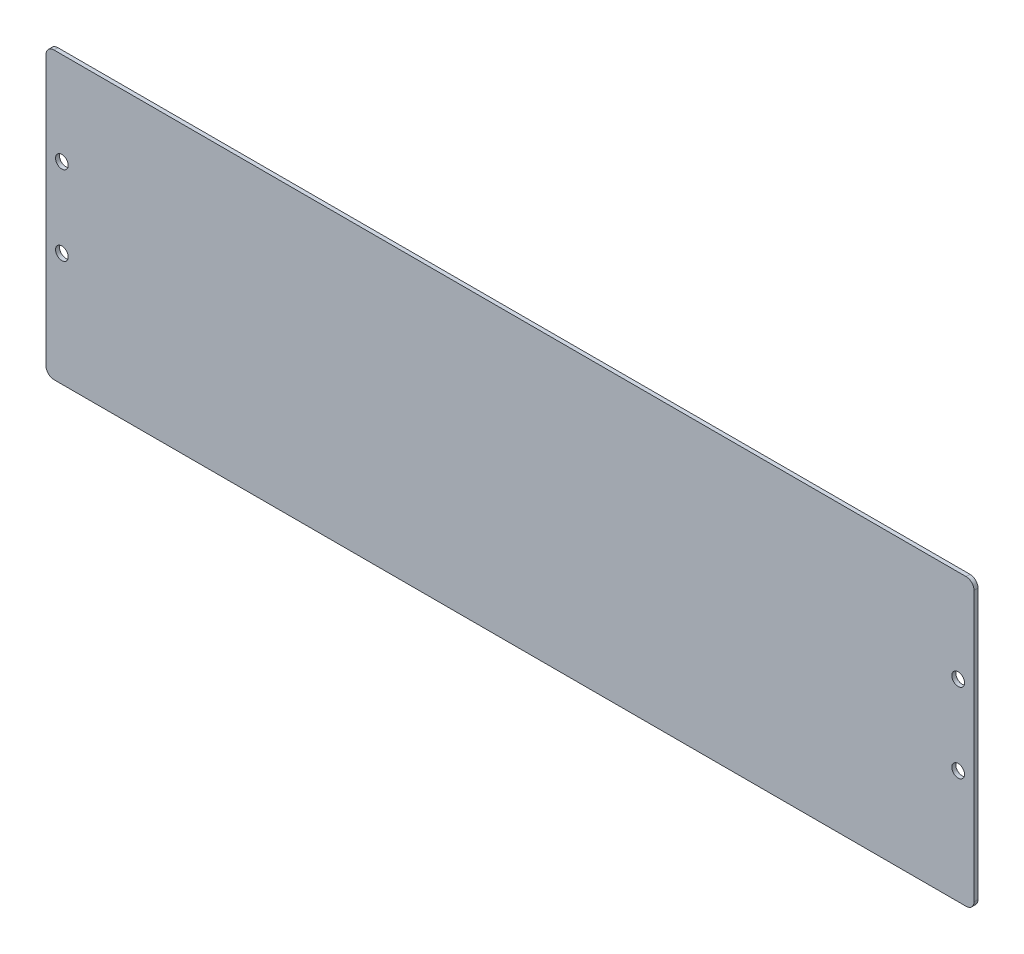
ISO-10303-21;
HEADER;
FILE_DESCRIPTION(('STEP AP214'),'2;1');
FILE_NAME('part.step','',(''),(''),'','','');
FILE_SCHEMA(('AUTOMOTIVE_DESIGN { 1 0 10303 214 1 1 1 1 }'));
ENDSEC;
DATA;
#1=APPLICATION_CONTEXT('core data for automotive mechanical design processes');
#2=APPLICATION_PROTOCOL_DEFINITION('international standard','automotive_design',2000,#1);
#3=PRODUCT_CONTEXT('',#1,'mechanical');
#4=PRODUCT('Part','Part','',(#3));
#5=PRODUCT_RELATED_PRODUCT_CATEGORY('part','',(#4));
#6=PRODUCT_DEFINITION_FORMATION('','',#4);
#7=PRODUCT_DEFINITION_CONTEXT('part definition',#1,'design');
#8=PRODUCT_DEFINITION('design','',#6,#7);
#9=PRODUCT_DEFINITION_SHAPE('','',#8);
#10=(LENGTH_UNIT() NAMED_UNIT(*) SI_UNIT(.MILLI.,.METRE.));
#11=(NAMED_UNIT(*) PLANE_ANGLE_UNIT() SI_UNIT($,.RADIAN.));
#12=(NAMED_UNIT(*) SI_UNIT($,.STERADIAN.) SOLID_ANGLE_UNIT());
#13=UNCERTAINTY_MEASURE_WITH_UNIT(LENGTH_MEASURE(1.E-05),#10,'distance_accuracy_value','');
#14=(GEOMETRIC_REPRESENTATION_CONTEXT(3) GLOBAL_UNCERTAINTY_ASSIGNED_CONTEXT((#13)) GLOBAL_UNIT_ASSIGNED_CONTEXT((#10,
#11,#12)) REPRESENTATION_CONTEXT('',''));
#15=CARTESIAN_POINT('',(0.,0.,0.));
#16=DIRECTION('',(0.,0.,1.));
#17=DIRECTION('',(1.,0.,0.));
#18=AXIS2_PLACEMENT_3D('',#15,#16,#17);
#19=CARTESIAN_POINT('',(0.,0.,1.));
#20=DIRECTION('',(0.,0.,-1.));
#21=DIRECTION('',(-1.,0.,0.));
#22=AXIS2_PLACEMENT_3D('',#19,#20,#21);
#23=PLANE('',#22);
#24=DIRECTION('',(1.,0.,0.));
#25=VECTOR('',#24,1.);
#26=CARTESIAN_POINT('',(-117.,-36.,1.));
#27=LINE('',#26,#25);
#28=CARTESIAN_POINT('',(-115.,-36.,1.));
#29=VERTEX_POINT('',#28);
#30=CARTESIAN_POINT('',(115.,-36.,1.));
#31=VERTEX_POINT('',#30);
#32=EDGE_CURVE('E140',#29,#31,#27,.T.);
#33=ORIENTED_EDGE('',*,*,#32,.T.);
#34=CARTESIAN_POINT('',(115.,-34.,1.));
#35=DIRECTION('',(0.,0.,-1.));
#36=DIRECTION('',(-1.,0.,0.));
#37=AXIS2_PLACEMENT_3D('',#34,#35,#36);
#38=CIRCLE('',#37,2.);
#39=CARTESIAN_POINT('',(117.,-34.,1.));
#40=VERTEX_POINT('',#39);
#41=EDGE_CURVE('E158',#31,#40,#38,.F.);
#42=ORIENTED_EDGE('',*,*,#41,.T.);
#43=DIRECTION('',(0.,1.,0.));
#44=VECTOR('',#43,1.);
#45=CARTESIAN_POINT('',(117.,-36.,1.));
#46=LINE('',#45,#44);
#47=CARTESIAN_POINT('',(117.,34.,1.));
#48=VERTEX_POINT('',#47);
#49=EDGE_CURVE('E122',#40,#48,#46,.T.);
#50=ORIENTED_EDGE('',*,*,#49,.T.);
#51=CARTESIAN_POINT('',(115.,34.,1.));
#52=DIRECTION('',(0.,0.,-1.));
#53=DIRECTION('',(-1.,0.,0.));
#54=AXIS2_PLACEMENT_3D('',#51,#52,#53);
#55=CIRCLE('',#54,2.);
#56=CARTESIAN_POINT('',(115.,36.,1.));
#57=VERTEX_POINT('',#56);
#58=EDGE_CURVE('E154',#48,#57,#55,.F.);
#59=ORIENTED_EDGE('',*,*,#58,.T.);
#60=DIRECTION('',(-1.,0.,0.));
#61=VECTOR('',#60,1.);
#62=CARTESIAN_POINT('',(-117.,36.,1.));
#63=LINE('',#62,#61);
#64=CARTESIAN_POINT('',(-115.,36.,1.));
#65=VERTEX_POINT('',#64);
#66=EDGE_CURVE('E167',#57,#65,#63,.T.);
#67=ORIENTED_EDGE('',*,*,#66,.T.);
#68=CARTESIAN_POINT('',(-115.,34.,1.));
#69=DIRECTION('',(0.,0.,-1.));
#70=DIRECTION('',(-1.,0.,0.));
#71=AXIS2_PLACEMENT_3D('',#68,#69,#70);
#72=CIRCLE('',#71,2.);
#73=CARTESIAN_POINT('',(-117.,34.,1.));
#74=VERTEX_POINT('',#73);
#75=EDGE_CURVE('E57',#65,#74,#72,.F.);
#76=ORIENTED_EDGE('',*,*,#75,.T.);
#77=DIRECTION('',(0.,-1.,0.));
#78=VECTOR('',#77,1.);
#79=CARTESIAN_POINT('',(-117.,-36.,1.));
#80=LINE('',#79,#78);
#81=CARTESIAN_POINT('',(-117.,-34.,1.));
#82=VERTEX_POINT('',#81);
#83=EDGE_CURVE('E173',#74,#82,#80,.T.);
#84=ORIENTED_EDGE('',*,*,#83,.T.);
#85=CARTESIAN_POINT('',(-115.,-34.,1.));
#86=DIRECTION('',(0.,0.,-1.));
#87=DIRECTION('',(-1.,0.,0.));
#88=AXIS2_PLACEMENT_3D('',#85,#86,#87);
#89=CIRCLE('',#88,2.);
#90=EDGE_CURVE('E156',#82,#29,#89,.F.);
#91=ORIENTED_EDGE('',*,*,#90,.T.);
#92=EDGE_LOOP('',(#33,#42,#50,#59,#67,#76,#84,#91));
#93=FACE_BOUND('',#92,.T.);
#94=CARTESIAN_POINT('',(-113.,12.6,1.));
#95=DIRECTION('',(0.,0.,1.));
#96=DIRECTION('',(1.,0.,0.));
#97=AXIS2_PLACEMENT_3D('',#94,#95,#96);
#98=CIRCLE('',#97,1.6);
#99=CARTESIAN_POINT('',(-111.4,12.6,1.));
#100=VERTEX_POINT('',#99);
#101=EDGE_CURVE('E131',#100,#100,#98,.T.);
#102=ORIENTED_EDGE('',*,*,#101,.F.);
#103=EDGE_LOOP('',(#102));
#104=FACE_BOUND('',#103,.T.);
#105=CARTESIAN_POINT('',(-113.,-7.4,1.));
#106=DIRECTION('',(0.,0.,1.));
#107=DIRECTION('',(1.,0.,0.));
#108=AXIS2_PLACEMENT_3D('',#105,#106,#107);
#109=CIRCLE('',#108,1.60000000000001);
#110=CARTESIAN_POINT('',(-111.4,-7.4,1.));
#111=VERTEX_POINT('',#110);
#112=EDGE_CURVE('E188',#111,#111,#109,.T.);
#113=ORIENTED_EDGE('',*,*,#112,.F.);
#114=EDGE_LOOP('',(#113));
#115=FACE_BOUND('',#114,.T.);
#116=CARTESIAN_POINT('',(113.,-7.39999999999998,1.));
#117=DIRECTION('',(0.,0.,1.));
#118=DIRECTION('',(-1.,0.,0.));
#119=AXIS2_PLACEMENT_3D('',#116,#117,#118);
#120=CIRCLE('',#119,1.60000000000001);
#121=CARTESIAN_POINT('',(111.4,-7.39999999999998,1.));
#122=VERTEX_POINT('',#121);
#123=EDGE_CURVE('E193',#122,#122,#120,.T.);
#124=ORIENTED_EDGE('',*,*,#123,.F.);
#125=EDGE_LOOP('',(#124));
#126=FACE_BOUND('',#125,.T.);
#127=CARTESIAN_POINT('',(113.,12.6,1.));
#128=DIRECTION('',(0.,0.,1.));
#129=DIRECTION('',(-1.,0.,0.));
#130=AXIS2_PLACEMENT_3D('',#127,#128,#129);
#131=CIRCLE('',#130,1.6);
#132=CARTESIAN_POINT('',(111.4,12.6,1.));
#133=VERTEX_POINT('',#132);
#134=EDGE_CURVE('E199',#133,#133,#131,.T.);
#135=ORIENTED_EDGE('',*,*,#134,.F.);
#136=EDGE_LOOP('',(#135));
#137=FACE_BOUND('',#136,.T.);
#138=ADVANCED_FACE('F35',(#93,#104,#115,#126,#137),#23,.F.);
#139=CARTESIAN_POINT('',(0.,0.,0.));
#140=DIRECTION('',(0.,0.,-1.));
#141=DIRECTION('',(-1.,0.,0.));
#142=AXIS2_PLACEMENT_3D('',#139,#140,#141);
#143=PLANE('',#142);
#144=CARTESIAN_POINT('',(113.,-7.39999999999998,0.));
#145=DIRECTION('',(0.,0.,1.));
#146=DIRECTION('',(-1.,0.,0.));
#147=AXIS2_PLACEMENT_3D('',#144,#145,#146);
#148=CIRCLE('',#147,1.60000000000001);
#149=CARTESIAN_POINT('',(111.4,-7.39999999999998,0.));
#150=VERTEX_POINT('',#149);
#151=EDGE_CURVE('E196',#150,#150,#148,.T.);
#152=ORIENTED_EDGE('',*,*,#151,.T.);
#153=EDGE_LOOP('',(#152));
#154=FACE_BOUND('',#153,.T.);
#155=CARTESIAN_POINT('',(-113.,12.6,0.));
#156=DIRECTION('',(0.,0.,1.));
#157=DIRECTION('',(1.,0.,0.));
#158=AXIS2_PLACEMENT_3D('',#155,#156,#157);
#159=CIRCLE('',#158,1.6);
#160=CARTESIAN_POINT('',(-111.4,12.6,0.));
#161=VERTEX_POINT('',#160);
#162=EDGE_CURVE('E137',#161,#161,#159,.T.);
#163=ORIENTED_EDGE('',*,*,#162,.T.);
#164=EDGE_LOOP('',(#163));
#165=FACE_BOUND('',#164,.T.);
#166=DIRECTION('',(0.,1.,0.));
#167=VECTOR('',#166,1.);
#168=CARTESIAN_POINT('',(117.,-36.,0.));
#169=LINE('',#168,#167);
#170=CARTESIAN_POINT('',(117.,-34.,0.));
#171=VERTEX_POINT('',#170);
#172=CARTESIAN_POINT('',(117.,34.,0.));
#173=VERTEX_POINT('',#172);
#174=EDGE_CURVE('E119',#171,#173,#169,.T.);
#175=ORIENTED_EDGE('',*,*,#174,.F.);
#176=CARTESIAN_POINT('',(115.,-34.,0.));
#177=DIRECTION('',(0.,0.,-1.));
#178=DIRECTION('',(-1.,0.,0.));
#179=AXIS2_PLACEMENT_3D('',#176,#177,#178);
#180=CIRCLE('',#179,2.);
#181=CARTESIAN_POINT('',(115.,-36.,0.));
#182=VERTEX_POINT('',#181);
#183=EDGE_CURVE('E102',#171,#182,#180,.T.);
#184=ORIENTED_EDGE('',*,*,#183,.T.);
#185=DIRECTION('',(1.,0.,0.));
#186=VECTOR('',#185,1.);
#187=CARTESIAN_POINT('',(-117.,-36.,0.));
#188=LINE('',#187,#186);
#189=CARTESIAN_POINT('',(-115.,-36.,0.));
#190=VERTEX_POINT('',#189);
#191=EDGE_CURVE('E144',#190,#182,#188,.T.);
#192=ORIENTED_EDGE('',*,*,#191,.F.);
#193=CARTESIAN_POINT('',(-115.,-34.,0.));
#194=DIRECTION('',(0.,0.,-1.));
#195=DIRECTION('',(-1.,0.,0.));
#196=AXIS2_PLACEMENT_3D('',#193,#194,#195);
#197=CIRCLE('',#196,2.);
#198=CARTESIAN_POINT('',(-117.,-34.,0.));
#199=VERTEX_POINT('',#198);
#200=EDGE_CURVE('E113',#190,#199,#197,.T.);
#201=ORIENTED_EDGE('',*,*,#200,.T.);
#202=DIRECTION('',(0.,-1.,0.));
#203=VECTOR('',#202,1.);
#204=CARTESIAN_POINT('',(-117.,-36.,0.));
#205=LINE('',#204,#203);
#206=CARTESIAN_POINT('',(-117.,34.,0.));
#207=VERTEX_POINT('',#206);
#208=EDGE_CURVE('E134',#207,#199,#205,.T.);
#209=ORIENTED_EDGE('',*,*,#208,.F.);
#210=CARTESIAN_POINT('',(-115.,34.,0.));
#211=DIRECTION('',(0.,0.,-1.));
#212=DIRECTION('',(-1.,0.,0.));
#213=AXIS2_PLACEMENT_3D('',#210,#211,#212);
#214=CIRCLE('',#213,2.);
#215=CARTESIAN_POINT('',(-115.,36.,0.));
#216=VERTEX_POINT('',#215);
#217=EDGE_CURVE('E123',#207,#216,#214,.T.);
#218=ORIENTED_EDGE('',*,*,#217,.T.);
#219=DIRECTION('',(-1.,0.,0.));
#220=VECTOR('',#219,1.);
#221=CARTESIAN_POINT('',(-117.,36.,0.));
#222=LINE('',#221,#220);
#223=CARTESIAN_POINT('',(115.,36.,0.));
#224=VERTEX_POINT('',#223);
#225=EDGE_CURVE('E130',#224,#216,#222,.T.);
#226=ORIENTED_EDGE('',*,*,#225,.F.);
#227=CARTESIAN_POINT('',(115.,34.,0.));
#228=DIRECTION('',(0.,0.,-1.));
#229=DIRECTION('',(-1.,0.,0.));
#230=AXIS2_PLACEMENT_3D('',#227,#228,#229);
#231=CIRCLE('',#230,2.);
#232=EDGE_CURVE('E129',#224,#173,#231,.T.);
#233=ORIENTED_EDGE('',*,*,#232,.T.);
#234=EDGE_LOOP('',(#175,#184,#192,#201,#209,#218,#226,#233));
#235=FACE_BOUND('',#234,.T.);
#236=CARTESIAN_POINT('',(-113.,-7.4,0.));
#237=DIRECTION('',(0.,0.,1.));
#238=DIRECTION('',(1.,0.,0.));
#239=AXIS2_PLACEMENT_3D('',#236,#237,#238);
#240=CIRCLE('',#239,1.60000000000001);
#241=CARTESIAN_POINT('',(-111.4,-7.4,0.));
#242=VERTEX_POINT('',#241);
#243=EDGE_CURVE('E190',#242,#242,#240,.T.);
#244=ORIENTED_EDGE('',*,*,#243,.T.);
#245=EDGE_LOOP('',(#244));
#246=FACE_BOUND('',#245,.T.);
#247=CARTESIAN_POINT('',(113.,12.6,0.));
#248=DIRECTION('',(0.,0.,1.));
#249=DIRECTION('',(-1.,0.,0.));
#250=AXIS2_PLACEMENT_3D('',#247,#248,#249);
#251=CIRCLE('',#250,1.6);
#252=CARTESIAN_POINT('',(111.4,12.6,0.));
#253=VERTEX_POINT('',#252);
#254=EDGE_CURVE('E202',#253,#253,#251,.T.);
#255=ORIENTED_EDGE('',*,*,#254,.T.);
#256=EDGE_LOOP('',(#255));
#257=FACE_BOUND('',#256,.T.);
#258=ADVANCED_FACE('F126',(#154,#165,#235,#246,#257),#143,.T.);
#259=CARTESIAN_POINT('',(117.,-36.,1.));
#260=DIRECTION('',(-1.,0.,0.));
#261=DIRECTION('',(0.,0.,1.));
#262=AXIS2_PLACEMENT_3D('',#259,#260,#261);
#263=PLANE('',#262);
#264=ORIENTED_EDGE('',*,*,#49,.F.);
#265=DIRECTION('',(0.,0.,-1.));
#266=VECTOR('',#265,1.);
#267=CARTESIAN_POINT('',(117.,-34.,1.));
#268=LINE('',#267,#266);
#269=EDGE_CURVE('E106',#40,#171,#268,.T.);
#270=ORIENTED_EDGE('',*,*,#269,.T.);
#271=ORIENTED_EDGE('',*,*,#174,.T.);
#272=DIRECTION('',(0.,0.,-1.));
#273=VECTOR('',#272,1.);
#274=CARTESIAN_POINT('',(117.,34.,1.));
#275=LINE('',#274,#273);
#276=EDGE_CURVE('E124',#173,#48,#275,.F.);
#277=ORIENTED_EDGE('',*,*,#276,.T.);
#278=EDGE_LOOP('',(#264,#270,#271,#277));
#279=FACE_BOUND('',#278,.T.);
#280=ADVANCED_FACE('F118',(#279),#263,.F.);
#281=CARTESIAN_POINT('',(-117.,36.,1.));
#282=DIRECTION('',(0.,-1.,0.));
#283=DIRECTION('',(0.,0.,-1.));
#284=AXIS2_PLACEMENT_3D('',#281,#282,#283);
#285=PLANE('',#284);
#286=ORIENTED_EDGE('',*,*,#66,.F.);
#287=DIRECTION('',(0.,0.,-1.));
#288=VECTOR('',#287,1.);
#289=CARTESIAN_POINT('',(115.,36.,1.));
#290=LINE('',#289,#288);
#291=EDGE_CURVE('E11',#57,#224,#290,.T.);
#292=ORIENTED_EDGE('',*,*,#291,.T.);
#293=ORIENTED_EDGE('',*,*,#225,.T.);
#294=DIRECTION('',(0.,0.,-1.));
#295=VECTOR('',#294,1.);
#296=CARTESIAN_POINT('',(-115.,36.,1.));
#297=LINE('',#296,#295);
#298=EDGE_CURVE('E43',#216,#65,#297,.F.);
#299=ORIENTED_EDGE('',*,*,#298,.T.);
#300=EDGE_LOOP('',(#286,#292,#293,#299));
#301=FACE_BOUND('',#300,.T.);
#302=ADVANCED_FACE('F166',(#301),#285,.F.);
#303=CARTESIAN_POINT('',(-117.,-36.,1.));
#304=DIRECTION('',(1.,0.,0.));
#305=DIRECTION('',(0.,0.,-1.));
#306=AXIS2_PLACEMENT_3D('',#303,#304,#305);
#307=PLANE('',#306);
#308=ORIENTED_EDGE('',*,*,#208,.T.);
#309=DIRECTION('',(0.,0.,-1.));
#310=VECTOR('',#309,1.);
#311=CARTESIAN_POINT('',(-117.,-34.,1.));
#312=LINE('',#311,#310);
#313=EDGE_CURVE('E50',#199,#82,#312,.F.);
#314=ORIENTED_EDGE('',*,*,#313,.T.);
#315=ORIENTED_EDGE('',*,*,#83,.F.);
#316=DIRECTION('',(0.,0.,-1.));
#317=VECTOR('',#316,1.);
#318=CARTESIAN_POINT('',(-117.,34.,1.));
#319=LINE('',#318,#317);
#320=EDGE_CURVE('E160',#74,#207,#319,.T.);
#321=ORIENTED_EDGE('',*,*,#320,.T.);
#322=EDGE_LOOP('',(#308,#314,#315,#321));
#323=FACE_BOUND('',#322,.T.);
#324=ADVANCED_FACE('F177',(#323),#307,.F.);
#325=CARTESIAN_POINT('',(-117.,-36.,1.));
#326=DIRECTION('',(0.,1.,0.));
#327=DIRECTION('',(0.,0.,1.));
#328=AXIS2_PLACEMENT_3D('',#325,#326,#327);
#329=PLANE('',#328);
#330=ORIENTED_EDGE('',*,*,#191,.T.);
#331=DIRECTION('',(0.,0.,-1.));
#332=VECTOR('',#331,1.);
#333=CARTESIAN_POINT('',(115.,-36.,1.));
#334=LINE('',#333,#332);
#335=EDGE_CURVE('E107',#182,#31,#334,.F.);
#336=ORIENTED_EDGE('',*,*,#335,.T.);
#337=ORIENTED_EDGE('',*,*,#32,.F.);
#338=DIRECTION('',(0.,0.,-1.));
#339=VECTOR('',#338,1.);
#340=CARTESIAN_POINT('',(-115.,-36.,1.));
#341=LINE('',#340,#339);
#342=EDGE_CURVE('E112',#29,#190,#341,.T.);
#343=ORIENTED_EDGE('',*,*,#342,.T.);
#344=EDGE_LOOP('',(#330,#336,#337,#343));
#345=FACE_BOUND('',#344,.T.);
#346=ADVANCED_FACE('F184',(#345),#329,.F.);
#347=CARTESIAN_POINT('',(-113.,12.6,1.));
#348=DIRECTION('',(0.,0.,-1.));
#349=DIRECTION('',(-1.,0.,0.));
#350=AXIS2_PLACEMENT_3D('',#347,#348,#349);
#351=CYLINDRICAL_SURFACE('',#350,1.6);
#352=ORIENTED_EDGE('',*,*,#101,.T.);
#353=EDGE_LOOP('',(#352));
#354=FACE_BOUND('',#353,.T.);
#355=ORIENTED_EDGE('',*,*,#162,.F.);
#356=EDGE_LOOP('',(#355));
#357=FACE_BOUND('',#356,.T.);
#358=ADVANCED_FACE('F219',(#354,#357),#351,.F.);
#359=CARTESIAN_POINT('',(-113.,-7.4,1.));
#360=DIRECTION('',(0.,0.,-1.));
#361=DIRECTION('',(-1.,0.,0.));
#362=AXIS2_PLACEMENT_3D('',#359,#360,#361);
#363=CYLINDRICAL_SURFACE('',#362,1.60000000000001);
#364=ORIENTED_EDGE('',*,*,#112,.T.);
#365=EDGE_LOOP('',(#364));
#366=FACE_BOUND('',#365,.T.);
#367=ORIENTED_EDGE('',*,*,#243,.F.);
#368=EDGE_LOOP('',(#367));
#369=FACE_BOUND('',#368,.T.);
#370=ADVANCED_FACE('F311',(#366,#369),#363,.F.);
#371=CARTESIAN_POINT('',(113.,-7.39999999999998,1.));
#372=DIRECTION('',(0.,0.,-1.));
#373=DIRECTION('',(-1.,0.,0.));
#374=AXIS2_PLACEMENT_3D('',#371,#372,#373);
#375=CYLINDRICAL_SURFACE('',#374,1.60000000000001);
#376=ORIENTED_EDGE('',*,*,#123,.T.);
#377=EDGE_LOOP('',(#376));
#378=FACE_BOUND('',#377,.T.);
#379=ORIENTED_EDGE('',*,*,#151,.F.);
#380=EDGE_LOOP('',(#379));
#381=FACE_BOUND('',#380,.T.);
#382=ADVANCED_FACE('F302',(#378,#381),#375,.F.);
#383=CARTESIAN_POINT('',(113.,12.6,1.));
#384=DIRECTION('',(0.,0.,-1.));
#385=DIRECTION('',(-1.,0.,0.));
#386=AXIS2_PLACEMENT_3D('',#383,#384,#385);
#387=CYLINDRICAL_SURFACE('',#386,1.6);
#388=ORIENTED_EDGE('',*,*,#134,.T.);
#389=EDGE_LOOP('',(#388));
#390=FACE_BOUND('',#389,.T.);
#391=ORIENTED_EDGE('',*,*,#254,.F.);
#392=EDGE_LOOP('',(#391));
#393=FACE_BOUND('',#392,.T.);
#394=ADVANCED_FACE('F208',(#390,#393),#387,.F.);
#395=CARTESIAN_POINT('',(115.,-34.,1.));
#396=DIRECTION('',(0.,0.,-1.));
#397=DIRECTION('',(-1.,0.,0.));
#398=AXIS2_PLACEMENT_3D('',#395,#396,#397);
#399=CYLINDRICAL_SURFACE('',#398,2.);
#400=ORIENTED_EDGE('',*,*,#41,.F.);
#401=ORIENTED_EDGE('',*,*,#335,.F.);
#402=ORIENTED_EDGE('',*,*,#183,.F.);
#403=ORIENTED_EDGE('',*,*,#269,.F.);
#404=EDGE_LOOP('',(#400,#401,#402,#403));
#405=FACE_BOUND('',#404,.T.);
#406=ADVANCED_FACE('F105',(#405),#399,.T.);
#407=CARTESIAN_POINT('',(-115.,-34.,1.));
#408=DIRECTION('',(0.,0.,-1.));
#409=DIRECTION('',(-1.,0.,0.));
#410=AXIS2_PLACEMENT_3D('',#407,#408,#409);
#411=CYLINDRICAL_SURFACE('',#410,2.);
#412=ORIENTED_EDGE('',*,*,#90,.F.);
#413=ORIENTED_EDGE('',*,*,#313,.F.);
#414=ORIENTED_EDGE('',*,*,#200,.F.);
#415=ORIENTED_EDGE('',*,*,#342,.F.);
#416=EDGE_LOOP('',(#412,#413,#414,#415));
#417=FACE_BOUND('',#416,.T.);
#418=ADVANCED_FACE('F181',(#417),#411,.T.);
#419=CARTESIAN_POINT('',(115.,34.,1.));
#420=DIRECTION('',(0.,0.,-1.));
#421=DIRECTION('',(-1.,0.,0.));
#422=AXIS2_PLACEMENT_3D('',#419,#420,#421);
#423=CYLINDRICAL_SURFACE('',#422,2.);
#424=ORIENTED_EDGE('',*,*,#58,.F.);
#425=ORIENTED_EDGE('',*,*,#276,.F.);
#426=ORIENTED_EDGE('',*,*,#232,.F.);
#427=ORIENTED_EDGE('',*,*,#291,.F.);
#428=EDGE_LOOP('',(#424,#425,#426,#427));
#429=FACE_BOUND('',#428,.T.);
#430=ADVANCED_FACE('F233',(#429),#423,.T.);
#431=CARTESIAN_POINT('',(-115.,34.,1.));
#432=DIRECTION('',(0.,0.,-1.));
#433=DIRECTION('',(-1.,0.,0.));
#434=AXIS2_PLACEMENT_3D('',#431,#432,#433);
#435=CYLINDRICAL_SURFACE('',#434,2.);
#436=ORIENTED_EDGE('',*,*,#75,.F.);
#437=ORIENTED_EDGE('',*,*,#298,.F.);
#438=ORIENTED_EDGE('',*,*,#217,.F.);
#439=ORIENTED_EDGE('',*,*,#320,.F.);
#440=EDGE_LOOP('',(#436,#437,#438,#439));
#441=FACE_BOUND('',#440,.T.);
#442=ADVANCED_FACE('F37',(#441),#435,.T.);
#443=CLOSED_SHELL('',(#138,#258,#280,#302,#324,#346,#358,#370,#382,#394,#406,#418,#430,#442));
#444=MANIFOLD_SOLID_BREP('B2',#443);
#445=ADVANCED_BREP_SHAPE_REPRESENTATION('',(#18,#444),#14);
#446=SHAPE_DEFINITION_REPRESENTATION(#9,#445);
ENDSEC;
END-ISO-10303-21;
